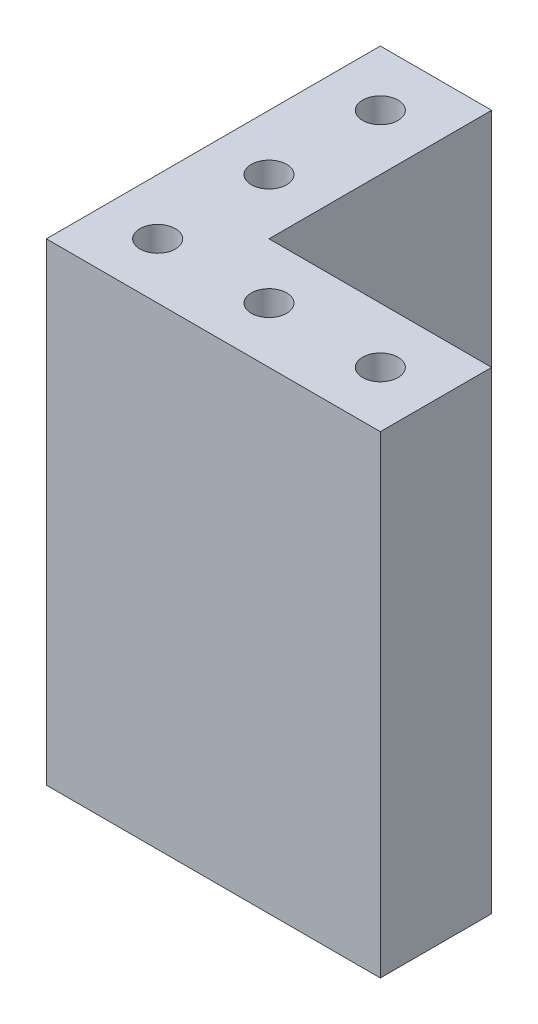
ISO-10303-21;
HEADER;
FILE_DESCRIPTION(('STEP AP214'),'2;1');
FILE_NAME('part.step','',(''),(''),'','','');
FILE_SCHEMA(('AUTOMOTIVE_DESIGN { 1 0 10303 214 1 1 1 1 }'));
ENDSEC;
DATA;
#1=APPLICATION_CONTEXT('core data for automotive mechanical design processes');
#2=APPLICATION_PROTOCOL_DEFINITION('international standard','automotive_design',2000,#1);
#3=PRODUCT_CONTEXT('',#1,'mechanical');
#4=PRODUCT('Part','Part','',(#3));
#5=PRODUCT_RELATED_PRODUCT_CATEGORY('part','',(#4));
#6=PRODUCT_DEFINITION_FORMATION('','',#4);
#7=PRODUCT_DEFINITION_CONTEXT('part definition',#1,'design');
#8=PRODUCT_DEFINITION('design','',#6,#7);
#9=PRODUCT_DEFINITION_SHAPE('','',#8);
#10=(LENGTH_UNIT() NAMED_UNIT(*) SI_UNIT(.MILLI.,.METRE.));
#11=(NAMED_UNIT(*) PLANE_ANGLE_UNIT() SI_UNIT($,.RADIAN.));
#12=(NAMED_UNIT(*) SI_UNIT($,.STERADIAN.) SOLID_ANGLE_UNIT());
#13=UNCERTAINTY_MEASURE_WITH_UNIT(LENGTH_MEASURE(1.E-05),#10,'distance_accuracy_value','');
#14=(GEOMETRIC_REPRESENTATION_CONTEXT(3) GLOBAL_UNCERTAINTY_ASSIGNED_CONTEXT((#13)) GLOBAL_UNIT_ASSIGNED_CONTEXT((#10,
#11,#12)) REPRESENTATION_CONTEXT('',''));
#15=CARTESIAN_POINT('',(0.,0.,0.));
#16=DIRECTION('',(0.,0.,1.));
#17=DIRECTION('',(1.,0.,0.));
#18=AXIS2_PLACEMENT_3D('',#15,#16,#17);
#19=CARTESIAN_POINT('',(0.,53.975,0.));
#20=DIRECTION('',(0.,1.,0.));
#21=DIRECTION('',(0.,0.,1.));
#22=AXIS2_PLACEMENT_3D('',#19,#20,#21);
#23=PLANE('',#22);
#24=CARTESIAN_POINT('',(0.,53.975,-12.7));
#25=DIRECTION('',(0.,1.,0.));
#26=DIRECTION('',(0.,0.,1.));
#27=AXIS2_PLACEMENT_3D('',#24,#25,#26);
#28=CIRCLE('',#27,2.0193);
#29=CARTESIAN_POINT('',(0.,53.975,-10.6807));
#30=VERTEX_POINT('',#29);
#31=EDGE_CURVE('E201',#30,#30,#28,.T.);
#32=ORIENTED_EDGE('',*,*,#31,.F.);
#33=EDGE_LOOP('',(#32));
#34=FACE_BOUND('',#33,.T.);
#35=CARTESIAN_POINT('',(12.7,53.975,0.));
#36=DIRECTION('',(0.,1.,0.));
#37=DIRECTION('',(0.,0.,1.));
#38=AXIS2_PLACEMENT_3D('',#35,#36,#37);
#39=CIRCLE('',#38,2.0193);
#40=CARTESIAN_POINT('',(12.7,53.975,2.0193));
#41=VERTEX_POINT('',#40);
#42=EDGE_CURVE('E213',#41,#41,#39,.T.);
#43=ORIENTED_EDGE('',*,*,#42,.F.);
#44=EDGE_LOOP('',(#43));
#45=FACE_BOUND('',#44,.T.);
#46=DIRECTION('',(0.,0.,1.));
#47=VECTOR('',#46,1.);
#48=CARTESIAN_POINT('',(-6.35,53.975,6.35));
#49=LINE('',#48,#47);
#50=CARTESIAN_POINT('',(-6.35,53.975,-31.75));
#51=VERTEX_POINT('',#50);
#52=CARTESIAN_POINT('',(-6.35,53.975,6.35));
#53=VERTEX_POINT('',#52);
#54=EDGE_CURVE('E137',#51,#53,#49,.T.);
#55=ORIENTED_EDGE('',*,*,#54,.T.);
#56=DIRECTION('',(1.,0.,0.));
#57=VECTOR('',#56,1.);
#58=CARTESIAN_POINT('',(-6.35,53.975,6.35));
#59=LINE('',#58,#57);
#60=CARTESIAN_POINT('',(31.75,53.975,6.35));
#61=VERTEX_POINT('',#60);
#62=EDGE_CURVE('E95',#53,#61,#59,.T.);
#63=ORIENTED_EDGE('',*,*,#62,.T.);
#64=DIRECTION('',(0.,0.,-1.));
#65=VECTOR('',#64,1.);
#66=CARTESIAN_POINT('',(31.75,53.975,6.35));
#67=LINE('',#66,#65);
#68=CARTESIAN_POINT('',(31.75,53.975,-6.35));
#69=VERTEX_POINT('',#68);
#70=EDGE_CURVE('E108',#61,#69,#67,.T.);
#71=ORIENTED_EDGE('',*,*,#70,.T.);
#72=DIRECTION('',(-1.,0.,0.));
#73=VECTOR('',#72,1.);
#74=CARTESIAN_POINT('',(31.75,53.975,-6.35));
#75=LINE('',#74,#73);
#76=CARTESIAN_POINT('',(6.35,53.975,-6.35));
#77=VERTEX_POINT('',#76);
#78=EDGE_CURVE('E102',#69,#77,#75,.T.);
#79=ORIENTED_EDGE('',*,*,#78,.T.);
#80=DIRECTION('',(0.,0.,-1.));
#81=VECTOR('',#80,1.);
#82=CARTESIAN_POINT('',(6.35,53.975,-6.35));
#83=LINE('',#82,#81);
#84=CARTESIAN_POINT('',(6.35,53.975,-31.75));
#85=VERTEX_POINT('',#84);
#86=EDGE_CURVE('E106',#77,#85,#83,.T.);
#87=ORIENTED_EDGE('',*,*,#86,.T.);
#88=DIRECTION('',(-1.,0.,0.));
#89=VECTOR('',#88,1.);
#90=CARTESIAN_POINT('',(6.35,53.975,-31.75));
#91=LINE('',#90,#89);
#92=EDGE_CURVE('E58',#85,#51,#91,.T.);
#93=ORIENTED_EDGE('',*,*,#92,.T.);
#94=EDGE_LOOP('',(#55,#63,#71,#79,#87,#93));
#95=FACE_BOUND('',#94,.T.);
#96=CARTESIAN_POINT('',(0.,53.975,0.));
#97=DIRECTION('',(0.,1.,0.));
#98=DIRECTION('',(0.,0.,1.));
#99=AXIS2_PLACEMENT_3D('',#96,#97,#98);
#100=CIRCLE('',#99,2.0193);
#101=CARTESIAN_POINT('',(0.,53.975,2.0193));
#102=VERTEX_POINT('',#101);
#103=EDGE_CURVE('E130',#102,#102,#100,.T.);
#104=ORIENTED_EDGE('',*,*,#103,.F.);
#105=EDGE_LOOP('',(#104));
#106=FACE_BOUND('',#105,.T.);
#107=CARTESIAN_POINT('',(25.4,53.975,0.));
#108=DIRECTION('',(0.,1.,0.));
#109=DIRECTION('',(0.,0.,1.));
#110=AXIS2_PLACEMENT_3D('',#107,#108,#109);
#111=CIRCLE('',#110,2.0193);
#112=CARTESIAN_POINT('',(25.4,53.975,2.0193));
#113=VERTEX_POINT('',#112);
#114=EDGE_CURVE('E207',#113,#113,#111,.T.);
#115=ORIENTED_EDGE('',*,*,#114,.F.);
#116=EDGE_LOOP('',(#115));
#117=FACE_BOUND('',#116,.T.);
#118=CARTESIAN_POINT('',(0.,53.975,-25.4));
#119=DIRECTION('',(0.,1.,0.));
#120=DIRECTION('',(0.,0.,1.));
#121=AXIS2_PLACEMENT_3D('',#118,#119,#120);
#122=CIRCLE('',#121,2.0193);
#123=CARTESIAN_POINT('',(0.,53.975,-23.3807));
#124=VERTEX_POINT('',#123);
#125=EDGE_CURVE('E192',#124,#124,#122,.T.);
#126=ORIENTED_EDGE('',*,*,#125,.F.);
#127=EDGE_LOOP('',(#126));
#128=FACE_BOUND('',#127,.T.);
#129=ADVANCED_FACE('F41',(#34,#45,#95,#106,#117,#128),#23,.T.);
#130=CARTESIAN_POINT('',(0.,0.,0.));
#131=DIRECTION('',(0.,1.,0.));
#132=DIRECTION('',(0.,0.,1.));
#133=AXIS2_PLACEMENT_3D('',#130,#131,#132);
#134=PLANE('',#133);
#135=DIRECTION('',(0.,0.,1.));
#136=VECTOR('',#135,1.);
#137=CARTESIAN_POINT('',(-6.35,0.,6.35));
#138=LINE('',#137,#136);
#139=CARTESIAN_POINT('',(-6.35,0.,-31.75));
#140=VERTEX_POINT('',#139);
#141=CARTESIAN_POINT('',(-6.35,0.,6.35));
#142=VERTEX_POINT('',#141);
#143=EDGE_CURVE('E126',#140,#142,#138,.T.);
#144=ORIENTED_EDGE('',*,*,#143,.F.);
#145=DIRECTION('',(-1.,0.,0.));
#146=VECTOR('',#145,1.);
#147=CARTESIAN_POINT('',(6.35,0.,-31.75));
#148=LINE('',#147,#146);
#149=CARTESIAN_POINT('',(6.35,0.,-31.75));
#150=VERTEX_POINT('',#149);
#151=EDGE_CURVE('E87',#150,#140,#148,.T.);
#152=ORIENTED_EDGE('',*,*,#151,.F.);
#153=DIRECTION('',(0.,0.,-1.));
#154=VECTOR('',#153,1.);
#155=CARTESIAN_POINT('',(6.35,0.,-6.35));
#156=LINE('',#155,#154);
#157=CARTESIAN_POINT('',(6.35,0.,-6.35));
#158=VERTEX_POINT('',#157);
#159=EDGE_CURVE('E81',#158,#150,#156,.T.);
#160=ORIENTED_EDGE('',*,*,#159,.F.);
#161=DIRECTION('',(-1.,0.,0.));
#162=VECTOR('',#161,1.);
#163=CARTESIAN_POINT('',(31.75,0.,-6.35));
#164=LINE('',#163,#162);
#165=CARTESIAN_POINT('',(31.75,0.,-6.35));
#166=VERTEX_POINT('',#165);
#167=EDGE_CURVE('E116',#166,#158,#164,.T.);
#168=ORIENTED_EDGE('',*,*,#167,.F.);
#169=DIRECTION('',(0.,0.,-1.));
#170=VECTOR('',#169,1.);
#171=CARTESIAN_POINT('',(31.75,0.,6.35));
#172=LINE('',#171,#170);
#173=CARTESIAN_POINT('',(31.75,0.,6.35));
#174=VERTEX_POINT('',#173);
#175=EDGE_CURVE('E132',#174,#166,#172,.T.);
#176=ORIENTED_EDGE('',*,*,#175,.F.);
#177=DIRECTION('',(1.,0.,0.));
#178=VECTOR('',#177,1.);
#179=CARTESIAN_POINT('',(-6.35,0.,6.35));
#180=LINE('',#179,#178);
#181=EDGE_CURVE('E129',#142,#174,#180,.T.);
#182=ORIENTED_EDGE('',*,*,#181,.F.);
#183=EDGE_LOOP('',(#144,#152,#160,#168,#176,#182));
#184=FACE_BOUND('',#183,.T.);
#185=CARTESIAN_POINT('',(0.,0.,0.));
#186=DIRECTION('',(0.,1.,0.));
#187=DIRECTION('',(0.,0.,1.));
#188=AXIS2_PLACEMENT_3D('',#185,#186,#187);
#189=CIRCLE('',#188,2.0193);
#190=CARTESIAN_POINT('',(0.,0.,2.0193));
#191=VERTEX_POINT('',#190);
#192=EDGE_CURVE('E216',#191,#191,#189,.T.);
#193=ORIENTED_EDGE('',*,*,#192,.T.);
#194=EDGE_LOOP('',(#193));
#195=FACE_BOUND('',#194,.T.);
#196=CARTESIAN_POINT('',(12.7,0.,0.));
#197=DIRECTION('',(0.,1.,0.));
#198=DIRECTION('',(0.,0.,1.));
#199=AXIS2_PLACEMENT_3D('',#196,#197,#198);
#200=CIRCLE('',#199,2.0193);
#201=CARTESIAN_POINT('',(12.7,0.,2.0193));
#202=VERTEX_POINT('',#201);
#203=EDGE_CURVE('E210',#202,#202,#200,.T.);
#204=ORIENTED_EDGE('',*,*,#203,.T.);
#205=EDGE_LOOP('',(#204));
#206=FACE_BOUND('',#205,.T.);
#207=CARTESIAN_POINT('',(25.4,0.,0.));
#208=DIRECTION('',(0.,1.,0.));
#209=DIRECTION('',(0.,0.,1.));
#210=AXIS2_PLACEMENT_3D('',#207,#208,#209);
#211=CIRCLE('',#210,2.0193);
#212=CARTESIAN_POINT('',(25.4,0.,2.0193));
#213=VERTEX_POINT('',#212);
#214=EDGE_CURVE('E204',#213,#213,#211,.T.);
#215=ORIENTED_EDGE('',*,*,#214,.T.);
#216=EDGE_LOOP('',(#215));
#217=FACE_BOUND('',#216,.T.);
#218=CARTESIAN_POINT('',(0.,0.,-12.7));
#219=DIRECTION('',(0.,1.,0.));
#220=DIRECTION('',(0.,0.,1.));
#221=AXIS2_PLACEMENT_3D('',#218,#219,#220);
#222=CIRCLE('',#221,2.0193);
#223=CARTESIAN_POINT('',(0.,0.,-10.6807));
#224=VERTEX_POINT('',#223);
#225=EDGE_CURVE('E198',#224,#224,#222,.T.);
#226=ORIENTED_EDGE('',*,*,#225,.T.);
#227=EDGE_LOOP('',(#226));
#228=FACE_BOUND('',#227,.T.);
#229=CARTESIAN_POINT('',(0.,0.,-25.4));
#230=DIRECTION('',(0.,1.,0.));
#231=DIRECTION('',(0.,0.,1.));
#232=AXIS2_PLACEMENT_3D('',#229,#230,#231);
#233=CIRCLE('',#232,2.0193);
#234=CARTESIAN_POINT('',(0.,0.,-23.3807));
#235=VERTEX_POINT('',#234);
#236=EDGE_CURVE('E195',#235,#235,#233,.T.);
#237=ORIENTED_EDGE('',*,*,#236,.T.);
#238=EDGE_LOOP('',(#237));
#239=FACE_BOUND('',#238,.T.);
#240=ADVANCED_FACE('F146',(#184,#195,#206,#217,#228,#239),#134,.F.);
#241=CARTESIAN_POINT('',(-6.35,53.975,6.35));
#242=DIRECTION('',(1.,0.,0.));
#243=DIRECTION('',(0.,0.,-1.));
#244=AXIS2_PLACEMENT_3D('',#241,#242,#243);
#245=PLANE('',#244);
#246=ORIENTED_EDGE('',*,*,#143,.T.);
#247=DIRECTION('',(0.,-1.,0.));
#248=VECTOR('',#247,1.);
#249=CARTESIAN_POINT('',(-6.35,53.975,6.35));
#250=LINE('',#249,#248);
#251=EDGE_CURVE('E11',#53,#142,#250,.T.);
#252=ORIENTED_EDGE('',*,*,#251,.F.);
#253=ORIENTED_EDGE('',*,*,#54,.F.);
#254=DIRECTION('',(0.,-1.,0.));
#255=VECTOR('',#254,1.);
#256=CARTESIAN_POINT('',(-6.35,53.975,-31.75));
#257=LINE('',#256,#255);
#258=EDGE_CURVE('E122',#51,#140,#257,.T.);
#259=ORIENTED_EDGE('',*,*,#258,.T.);
#260=EDGE_LOOP('',(#246,#252,#253,#259));
#261=FACE_BOUND('',#260,.T.);
#262=ADVANCED_FACE('F43',(#261),#245,.F.);
#263=CARTESIAN_POINT('',(-6.35,53.975,6.35));
#264=DIRECTION('',(0.,0.,-1.));
#265=DIRECTION('',(-1.,0.,0.));
#266=AXIS2_PLACEMENT_3D('',#263,#264,#265);
#267=PLANE('',#266);
#268=ORIENTED_EDGE('',*,*,#181,.T.);
#269=DIRECTION('',(0.,-1.,0.));
#270=VECTOR('',#269,1.);
#271=CARTESIAN_POINT('',(31.75,53.975,6.35));
#272=LINE('',#271,#270);
#273=EDGE_CURVE('E50',#61,#174,#272,.T.);
#274=ORIENTED_EDGE('',*,*,#273,.F.);
#275=ORIENTED_EDGE('',*,*,#62,.F.);
#276=ORIENTED_EDGE('',*,*,#251,.T.);
#277=EDGE_LOOP('',(#268,#274,#275,#276));
#278=FACE_BOUND('',#277,.T.);
#279=ADVANCED_FACE('F288',(#278),#267,.F.);
#280=CARTESIAN_POINT('',(31.75,53.975,6.35));
#281=DIRECTION('',(-1.,0.,0.));
#282=DIRECTION('',(0.,0.,1.));
#283=AXIS2_PLACEMENT_3D('',#280,#281,#282);
#284=PLANE('',#283);
#285=ORIENTED_EDGE('',*,*,#175,.T.);
#286=DIRECTION('',(0.,-1.,0.));
#287=VECTOR('',#286,1.);
#288=CARTESIAN_POINT('',(31.75,53.975,-6.35));
#289=LINE('',#288,#287);
#290=EDGE_CURVE('E117',#69,#166,#289,.T.);
#291=ORIENTED_EDGE('',*,*,#290,.F.);
#292=ORIENTED_EDGE('',*,*,#70,.F.);
#293=ORIENTED_EDGE('',*,*,#273,.T.);
#294=EDGE_LOOP('',(#285,#291,#292,#293));
#295=FACE_BOUND('',#294,.T.);
#296=ADVANCED_FACE('F143',(#295),#284,.F.);
#297=CARTESIAN_POINT('',(31.75,53.975,-6.35));
#298=DIRECTION('',(0.,0.,1.));
#299=DIRECTION('',(1.,0.,0.));
#300=AXIS2_PLACEMENT_3D('',#297,#298,#299);
#301=PLANE('',#300);
#302=ORIENTED_EDGE('',*,*,#167,.T.);
#303=DIRECTION('',(0.,-1.,0.));
#304=VECTOR('',#303,1.);
#305=CARTESIAN_POINT('',(6.35,53.975,-6.35));
#306=LINE('',#305,#304);
#307=EDGE_CURVE('E113',#77,#158,#306,.T.);
#308=ORIENTED_EDGE('',*,*,#307,.F.);
#309=ORIENTED_EDGE('',*,*,#78,.F.);
#310=ORIENTED_EDGE('',*,*,#290,.T.);
#311=EDGE_LOOP('',(#302,#308,#309,#310));
#312=FACE_BOUND('',#311,.T.);
#313=ADVANCED_FACE('F114',(#312),#301,.F.);
#314=CARTESIAN_POINT('',(6.35,53.975,-6.35));
#315=DIRECTION('',(-1.,0.,0.));
#316=DIRECTION('',(0.,0.,1.));
#317=AXIS2_PLACEMENT_3D('',#314,#315,#316);
#318=PLANE('',#317);
#319=ORIENTED_EDGE('',*,*,#159,.T.);
#320=DIRECTION('',(0.,-1.,0.));
#321=VECTOR('',#320,1.);
#322=CARTESIAN_POINT('',(6.35,53.975,-31.75));
#323=LINE('',#322,#321);
#324=EDGE_CURVE('E118',#85,#150,#323,.T.);
#325=ORIENTED_EDGE('',*,*,#324,.F.);
#326=ORIENTED_EDGE('',*,*,#86,.F.);
#327=ORIENTED_EDGE('',*,*,#307,.T.);
#328=EDGE_LOOP('',(#319,#325,#326,#327));
#329=FACE_BOUND('',#328,.T.);
#330=ADVANCED_FACE('F120',(#329),#318,.F.);
#331=CARTESIAN_POINT('',(6.35,53.975,-31.75));
#332=DIRECTION('',(0.,0.,1.));
#333=DIRECTION('',(1.,0.,0.));
#334=AXIS2_PLACEMENT_3D('',#331,#332,#333);
#335=PLANE('',#334);
#336=ORIENTED_EDGE('',*,*,#151,.T.);
#337=ORIENTED_EDGE('',*,*,#258,.F.);
#338=ORIENTED_EDGE('',*,*,#92,.F.);
#339=ORIENTED_EDGE('',*,*,#324,.T.);
#340=EDGE_LOOP('',(#336,#337,#338,#339));
#341=FACE_BOUND('',#340,.T.);
#342=ADVANCED_FACE('F151',(#341),#335,.F.);
#343=CARTESIAN_POINT('',(0.,53.975,0.));
#344=DIRECTION('',(0.,-1.,0.));
#345=DIRECTION('',(0.,0.,-1.));
#346=AXIS2_PLACEMENT_3D('',#343,#344,#345);
#347=CYLINDRICAL_SURFACE('',#346,2.0193);
#348=ORIENTED_EDGE('',*,*,#103,.T.);
#349=EDGE_LOOP('',(#348));
#350=FACE_BOUND('',#349,.T.);
#351=ORIENTED_EDGE('',*,*,#192,.F.);
#352=EDGE_LOOP('',(#351));
#353=FACE_BOUND('',#352,.T.);
#354=ADVANCED_FACE('F153',(#350,#353),#347,.F.);
#355=CARTESIAN_POINT('',(12.7,53.975,0.));
#356=DIRECTION('',(0.,-1.,0.));
#357=DIRECTION('',(0.,0.,-1.));
#358=AXIS2_PLACEMENT_3D('',#355,#356,#357);
#359=CYLINDRICAL_SURFACE('',#358,2.0193);
#360=ORIENTED_EDGE('',*,*,#42,.T.);
#361=EDGE_LOOP('',(#360));
#362=FACE_BOUND('',#361,.T.);
#363=ORIENTED_EDGE('',*,*,#203,.F.);
#364=EDGE_LOOP('',(#363));
#365=FACE_BOUND('',#364,.T.);
#366=ADVANCED_FACE('F159',(#362,#365),#359,.F.);
#367=CARTESIAN_POINT('',(25.4,53.975,0.));
#368=DIRECTION('',(0.,-1.,0.));
#369=DIRECTION('',(0.,0.,-1.));
#370=AXIS2_PLACEMENT_3D('',#367,#368,#369);
#371=CYLINDRICAL_SURFACE('',#370,2.0193);
#372=ORIENTED_EDGE('',*,*,#114,.T.);
#373=EDGE_LOOP('',(#372));
#374=FACE_BOUND('',#373,.T.);
#375=ORIENTED_EDGE('',*,*,#214,.F.);
#376=EDGE_LOOP('',(#375));
#377=FACE_BOUND('',#376,.T.);
#378=ADVANCED_FACE('F175',(#374,#377),#371,.F.);
#379=CARTESIAN_POINT('',(0.,53.975,-12.7));
#380=DIRECTION('',(0.,-1.,0.));
#381=DIRECTION('',(0.,0.,-1.));
#382=AXIS2_PLACEMENT_3D('',#379,#380,#381);
#383=CYLINDRICAL_SURFACE('',#382,2.0193);
#384=ORIENTED_EDGE('',*,*,#31,.T.);
#385=EDGE_LOOP('',(#384));
#386=FACE_BOUND('',#385,.T.);
#387=ORIENTED_EDGE('',*,*,#225,.F.);
#388=EDGE_LOOP('',(#387));
#389=FACE_BOUND('',#388,.T.);
#390=ADVANCED_FACE('F179',(#386,#389),#383,.F.);
#391=CARTESIAN_POINT('',(0.,53.975,-25.4));
#392=DIRECTION('',(0.,-1.,0.));
#393=DIRECTION('',(0.,0.,-1.));
#394=AXIS2_PLACEMENT_3D('',#391,#392,#393);
#395=CYLINDRICAL_SURFACE('',#394,2.0193);
#396=ORIENTED_EDGE('',*,*,#125,.T.);
#397=EDGE_LOOP('',(#396));
#398=FACE_BOUND('',#397,.T.);
#399=ORIENTED_EDGE('',*,*,#236,.F.);
#400=EDGE_LOOP('',(#399));
#401=FACE_BOUND('',#400,.T.);
#402=ADVANCED_FACE('F183',(#398,#401),#395,.F.);
#403=CLOSED_SHELL('',(#129,#240,#262,#279,#296,#313,#330,#342,#354,#366,#378,#390,#402));
#404=MANIFOLD_SOLID_BREP('B2',#403);
#405=ADVANCED_BREP_SHAPE_REPRESENTATION('',(#18,#404),#14);
#406=SHAPE_DEFINITION_REPRESENTATION(#9,#405);
ENDSEC;
END-ISO-10303-21;
